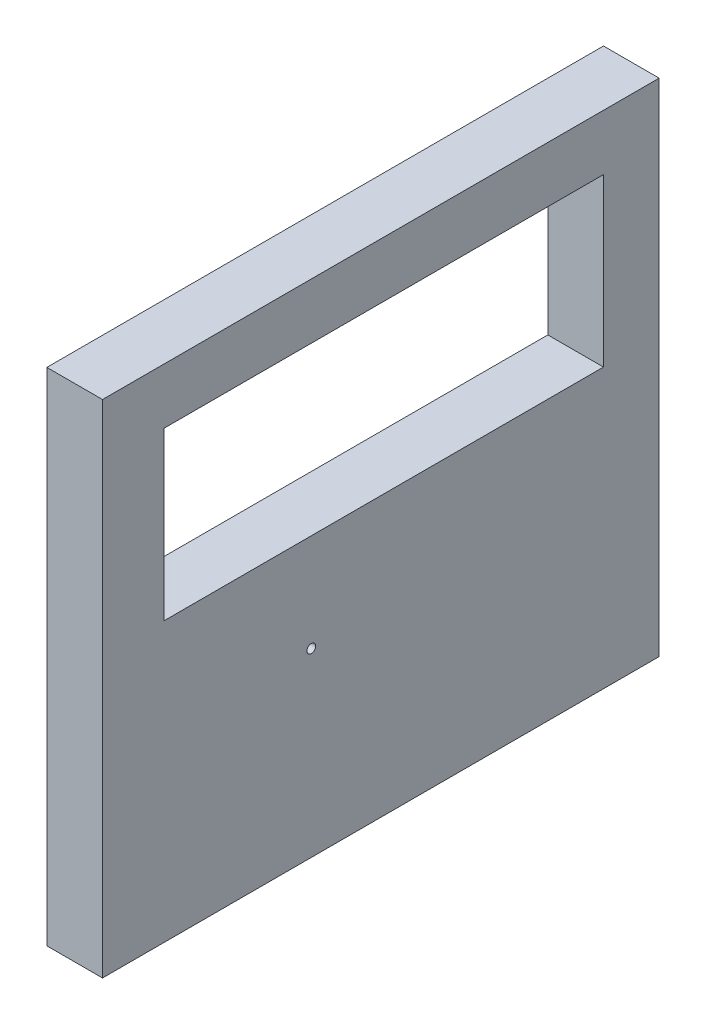
ISO-10303-21;
HEADER;
FILE_DESCRIPTION(('STEP AP214'),'2;1');
FILE_NAME('part.step','',(''),(''),'','','');
FILE_SCHEMA(('AUTOMOTIVE_DESIGN { 1 0 10303 214 1 1 1 1 }'));
ENDSEC;
DATA;
#1=APPLICATION_CONTEXT('core data for automotive mechanical design processes');
#2=APPLICATION_PROTOCOL_DEFINITION('international standard','automotive_design',2000,#1);
#3=PRODUCT_CONTEXT('',#1,'mechanical');
#4=PRODUCT('Part','Part','',(#3));
#5=PRODUCT_RELATED_PRODUCT_CATEGORY('part','',(#4));
#6=PRODUCT_DEFINITION_FORMATION('','',#4);
#7=PRODUCT_DEFINITION_CONTEXT('part definition',#1,'design');
#8=PRODUCT_DEFINITION('design','',#6,#7);
#9=PRODUCT_DEFINITION_SHAPE('','',#8);
#10=(LENGTH_UNIT() NAMED_UNIT(*) SI_UNIT(.MILLI.,.METRE.));
#11=(NAMED_UNIT(*) PLANE_ANGLE_UNIT() SI_UNIT($,.RADIAN.));
#12=(NAMED_UNIT(*) SI_UNIT($,.STERADIAN.) SOLID_ANGLE_UNIT());
#13=UNCERTAINTY_MEASURE_WITH_UNIT(LENGTH_MEASURE(1.E-05),#10,'distance_accuracy_value','');
#14=(GEOMETRIC_REPRESENTATION_CONTEXT(3) GLOBAL_UNCERTAINTY_ASSIGNED_CONTEXT((#13)) GLOBAL_UNIT_ASSIGNED_CONTEXT((#10,
#11,#12)) REPRESENTATION_CONTEXT('',''));
#15=CARTESIAN_POINT('',(0.,0.,0.));
#16=DIRECTION('',(0.,0.,1.));
#17=DIRECTION('',(1.,0.,0.));
#18=AXIS2_PLACEMENT_3D('',#15,#16,#17);
#19=CARTESIAN_POINT('',(12.7,-114.3,254.));
#20=DIRECTION('',(-1.,0.,0.));
#21=DIRECTION('',(0.,0.,1.));
#22=AXIS2_PLACEMENT_3D('',#19,#20,#21);
#23=PLANE('',#22);
#24=CARTESIAN_POINT('',(12.7,-31.75,158.75));
#25=DIRECTION('',(1.,0.,0.));
#26=DIRECTION('',(0.,0.,-1.));
#27=AXIS2_PLACEMENT_3D('',#24,#25,#26);
#28=CIRCLE('',#27,2.);
#29=CARTESIAN_POINT('',(12.7,-31.75,156.75));
#30=VERTEX_POINT('',#29);
#31=EDGE_CURVE('E127',#30,#30,#28,.T.);
#32=ORIENTED_EDGE('',*,*,#31,.F.);
#33=EDGE_LOOP('',(#32));
#34=FACE_BOUND('',#33,.T.);
#35=DIRECTION('',(0.,1.,0.));
#36=VECTOR('',#35,1.);
#37=CARTESIAN_POINT('',(12.7,-114.3,0.));
#38=LINE('',#37,#36);
#39=CARTESIAN_POINT('',(12.7,-114.3,0.));
#40=VERTEX_POINT('',#39);
#41=CARTESIAN_POINT('',(12.7,114.3,0.));
#42=VERTEX_POINT('',#41);
#43=EDGE_CURVE('E140',#40,#42,#38,.T.);
#44=ORIENTED_EDGE('',*,*,#43,.T.);
#45=DIRECTION('',(0.,0.,-1.));
#46=VECTOR('',#45,1.);
#47=CARTESIAN_POINT('',(12.7,114.3,254.));
#48=LINE('',#47,#46);
#49=CARTESIAN_POINT('',(12.7,114.3,254.));
#50=VERTEX_POINT('',#49);
#51=EDGE_CURVE('E11',#50,#42,#48,.T.);
#52=ORIENTED_EDGE('',*,*,#51,.F.);
#53=DIRECTION('',(0.,1.,0.));
#54=VECTOR('',#53,1.);
#55=CARTESIAN_POINT('',(12.7,-114.3,254.));
#56=LINE('',#55,#54);
#57=CARTESIAN_POINT('',(12.7,-114.3,254.));
#58=VERTEX_POINT('',#57);
#59=EDGE_CURVE('E144',#58,#50,#56,.T.);
#60=ORIENTED_EDGE('',*,*,#59,.F.);
#61=DIRECTION('',(0.,0.,-1.));
#62=VECTOR('',#61,1.);
#63=CARTESIAN_POINT('',(12.7,-114.3,254.));
#64=LINE('',#63,#62);
#65=EDGE_CURVE('E154',#58,#40,#64,.T.);
#66=ORIENTED_EDGE('',*,*,#65,.T.);
#67=EDGE_LOOP('',(#44,#52,#60,#66));
#68=FACE_BOUND('',#67,.T.);
#69=DIRECTION('',(0.,0.,-1.));
#70=VECTOR('',#69,1.);
#71=CARTESIAN_POINT('',(12.7,88.9000000000001,0.));
#72=LINE('',#71,#70);
#73=CARTESIAN_POINT('',(12.7,88.9,226.000000100001));
#74=VERTEX_POINT('',#73);
#75=CARTESIAN_POINT('',(12.7,88.9000000000001,25.4000001000014));
#76=VERTEX_POINT('',#75);
#77=EDGE_CURVE('E55',#74,#76,#72,.T.);
#78=ORIENTED_EDGE('',*,*,#77,.T.);
#79=DIRECTION('',(0.,-1.,-1.31450241935415E-09));
#80=VECTOR('',#79,1.);
#81=CARTESIAN_POINT('',(12.7,-3.33883614294356E-08,25.3999999831421));
#82=LINE('',#81,#80);
#83=CARTESIAN_POINT('',(12.7,12.8250000000002,25.4000000000006));
#84=VERTEX_POINT('',#83);
#85=EDGE_CURVE('E121',#76,#84,#82,.T.);
#86=ORIENTED_EDGE('',*,*,#85,.T.);
#87=DIRECTION('',(0.,0.,1.));
#88=VECTOR('',#87,1.);
#89=CARTESIAN_POINT('',(12.7,12.8250000000002,0.));
#90=LINE('',#89,#88);
#91=CARTESIAN_POINT('',(12.7,12.825,226.000000100001));
#92=VERTEX_POINT('',#91);
#93=EDGE_CURVE('E124',#84,#92,#90,.T.);
#94=ORIENTED_EDGE('',*,*,#93,.T.);
#95=DIRECTION('',(0.,-1.,0.));
#96=VECTOR('',#95,1.);
#97=CARTESIAN_POINT('',(12.7,0.,226.000000100001));
#98=LINE('',#97,#96);
#99=EDGE_CURVE('E133',#74,#92,#98,.T.);
#100=ORIENTED_EDGE('',*,*,#99,.F.);
#101=EDGE_LOOP('',(#78,#86,#94,#100));
#102=FACE_BOUND('',#101,.T.);
#103=ADVANCED_FACE('F41',(#34,#68,#102),#23,.F.);
#104=CARTESIAN_POINT('',(-12.7,-114.3,254.));
#105=DIRECTION('',(1.,0.,0.));
#106=DIRECTION('',(0.,0.,-1.));
#107=AXIS2_PLACEMENT_3D('',#104,#105,#106);
#108=PLANE('',#107);
#109=CARTESIAN_POINT('',(-12.7,-31.75,158.75));
#110=DIRECTION('',(1.,0.,0.));
#111=DIRECTION('',(0.,0.,-1.));
#112=AXIS2_PLACEMENT_3D('',#109,#110,#111);
#113=CIRCLE('',#112,2.);
#114=CARTESIAN_POINT('',(-12.7,-31.75,156.75));
#115=VERTEX_POINT('',#114);
#116=EDGE_CURVE('E134',#115,#115,#113,.T.);
#117=ORIENTED_EDGE('',*,*,#116,.T.);
#118=EDGE_LOOP('',(#117));
#119=FACE_BOUND('',#118,.T.);
#120=DIRECTION('',(0.,-1.,0.));
#121=VECTOR('',#120,1.);
#122=CARTESIAN_POINT('',(-12.7,-114.3,0.));
#123=LINE('',#122,#121);
#124=CARTESIAN_POINT('',(-12.7,114.3,0.));
#125=VERTEX_POINT('',#124);
#126=CARTESIAN_POINT('',(-12.7,-114.3,0.));
#127=VERTEX_POINT('',#126);
#128=EDGE_CURVE('E159',#125,#127,#123,.T.);
#129=ORIENTED_EDGE('',*,*,#128,.T.);
#130=DIRECTION('',(0.,0.,-1.));
#131=VECTOR('',#130,1.);
#132=CARTESIAN_POINT('',(-12.7,-114.3,254.));
#133=LINE('',#132,#131);
#134=CARTESIAN_POINT('',(-12.7,-114.3,254.));
#135=VERTEX_POINT('',#134);
#136=EDGE_CURVE('E164',#135,#127,#133,.T.);
#137=ORIENTED_EDGE('',*,*,#136,.F.);
#138=DIRECTION('',(0.,-1.,0.));
#139=VECTOR('',#138,1.);
#140=CARTESIAN_POINT('',(-12.7,-114.3,254.));
#141=LINE('',#140,#139);
#142=CARTESIAN_POINT('',(-12.7,114.3,254.));
#143=VERTEX_POINT('',#142);
#144=EDGE_CURVE('E150',#143,#135,#141,.T.);
#145=ORIENTED_EDGE('',*,*,#144,.F.);
#146=DIRECTION('',(0.,0.,-1.));
#147=VECTOR('',#146,1.);
#148=CARTESIAN_POINT('',(-12.7,114.3,254.));
#149=LINE('',#148,#147);
#150=EDGE_CURVE('E48',#143,#125,#149,.T.);
#151=ORIENTED_EDGE('',*,*,#150,.T.);
#152=EDGE_LOOP('',(#129,#137,#145,#151));
#153=FACE_BOUND('',#152,.T.);
#154=DIRECTION('',(0.,0.,-1.));
#155=VECTOR('',#154,1.);
#156=CARTESIAN_POINT('',(-12.7,88.9000000000001,0.));
#157=LINE('',#156,#155);
#158=CARTESIAN_POINT('',(-12.7,88.9,226.000000100001));
#159=VERTEX_POINT('',#158);
#160=CARTESIAN_POINT('',(-12.7,88.9000000000001,25.4000001000014));
#161=VERTEX_POINT('',#160);
#162=EDGE_CURVE('E107',#159,#161,#157,.T.);
#163=ORIENTED_EDGE('',*,*,#162,.F.);
#164=DIRECTION('',(0.,-1.,0.));
#165=VECTOR('',#164,1.);
#166=CARTESIAN_POINT('',(-12.7,0.,226.000000100001));
#167=LINE('',#166,#165);
#168=CARTESIAN_POINT('',(-12.7,12.825,226.000000100001));
#169=VERTEX_POINT('',#168);
#170=EDGE_CURVE('E113',#159,#169,#167,.T.);
#171=ORIENTED_EDGE('',*,*,#170,.T.);
#172=DIRECTION('',(0.,0.,1.));
#173=VECTOR('',#172,1.);
#174=CARTESIAN_POINT('',(-12.7,12.8250000000002,0.));
#175=LINE('',#174,#173);
#176=CARTESIAN_POINT('',(-12.7,12.8250000000002,25.4000000000006));
#177=VERTEX_POINT('',#176);
#178=EDGE_CURVE('E117',#177,#169,#175,.T.);
#179=ORIENTED_EDGE('',*,*,#178,.F.);
#180=DIRECTION('',(0.,-1.,-1.31450241935415E-09));
#181=VECTOR('',#180,1.);
#182=CARTESIAN_POINT('',(-12.7,-3.33883614294356E-08,25.3999999831421));
#183=LINE('',#182,#181);
#184=EDGE_CURVE('E110',#161,#177,#183,.T.);
#185=ORIENTED_EDGE('',*,*,#184,.F.);
#186=EDGE_LOOP('',(#163,#171,#179,#185));
#187=FACE_BOUND('',#186,.T.);
#188=ADVANCED_FACE('F120',(#119,#153,#187),#108,.F.);
#189=CARTESIAN_POINT('',(-12.7,114.3,254.));
#190=DIRECTION('',(0.,-1.,0.));
#191=DIRECTION('',(0.,0.,-1.));
#192=AXIS2_PLACEMENT_3D('',#189,#190,#191);
#193=PLANE('',#192);
#194=DIRECTION('',(-1.,0.,0.));
#195=VECTOR('',#194,1.);
#196=CARTESIAN_POINT('',(-12.7,114.3,0.));
#197=LINE('',#196,#195);
#198=EDGE_CURVE('E157',#42,#125,#197,.T.);
#199=ORIENTED_EDGE('',*,*,#198,.T.);
#200=ORIENTED_EDGE('',*,*,#150,.F.);
#201=DIRECTION('',(-1.,0.,0.));
#202=VECTOR('',#201,1.);
#203=CARTESIAN_POINT('',(-12.7,114.3,254.));
#204=LINE('',#203,#202);
#205=EDGE_CURVE('E147',#50,#143,#204,.T.);
#206=ORIENTED_EDGE('',*,*,#205,.F.);
#207=ORIENTED_EDGE('',*,*,#51,.T.);
#208=EDGE_LOOP('',(#199,#200,#206,#207));
#209=FACE_BOUND('',#208,.T.);
#210=ADVANCED_FACE('F187',(#209),#193,.F.);
#211=CARTESIAN_POINT('',(-12.7,-114.3,254.));
#212=DIRECTION('',(0.,1.,0.));
#213=DIRECTION('',(0.,0.,1.));
#214=AXIS2_PLACEMENT_3D('',#211,#212,#213);
#215=PLANE('',#214);
#216=DIRECTION('',(1.,0.,0.));
#217=VECTOR('',#216,1.);
#218=CARTESIAN_POINT('',(-12.7,-114.3,0.));
#219=LINE('',#218,#217);
#220=EDGE_CURVE('E148',#127,#40,#219,.T.);
#221=ORIENTED_EDGE('',*,*,#220,.T.);
#222=ORIENTED_EDGE('',*,*,#65,.F.);
#223=DIRECTION('',(1.,0.,0.));
#224=VECTOR('',#223,1.);
#225=CARTESIAN_POINT('',(-12.7,-114.3,254.));
#226=LINE('',#225,#224);
#227=EDGE_CURVE('E152',#135,#58,#226,.T.);
#228=ORIENTED_EDGE('',*,*,#227,.F.);
#229=ORIENTED_EDGE('',*,*,#136,.T.);
#230=EDGE_LOOP('',(#221,#222,#228,#229));
#231=FACE_BOUND('',#230,.T.);
#232=ADVANCED_FACE('F179',(#231),#215,.F.);
#233=CARTESIAN_POINT('',(0.,0.,254.));
#234=DIRECTION('',(0.,0.,-1.));
#235=DIRECTION('',(-1.,0.,0.));
#236=AXIS2_PLACEMENT_3D('',#233,#234,#235);
#237=PLANE('',#236);
#238=ORIENTED_EDGE('',*,*,#59,.T.);
#239=ORIENTED_EDGE('',*,*,#205,.T.);
#240=ORIENTED_EDGE('',*,*,#144,.T.);
#241=ORIENTED_EDGE('',*,*,#227,.T.);
#242=EDGE_LOOP('',(#238,#239,#240,#241));
#243=FACE_BOUND('',#242,.T.);
#244=ADVANCED_FACE('F186',(#243),#237,.F.);
#245=CARTESIAN_POINT('',(0.,0.,0.));
#246=DIRECTION('',(0.,0.,-1.));
#247=DIRECTION('',(-1.,0.,0.));
#248=AXIS2_PLACEMENT_3D('',#245,#246,#247);
#249=PLANE('',#248);
#250=ORIENTED_EDGE('',*,*,#43,.F.);
#251=ORIENTED_EDGE('',*,*,#220,.F.);
#252=ORIENTED_EDGE('',*,*,#128,.F.);
#253=ORIENTED_EDGE('',*,*,#198,.F.);
#254=EDGE_LOOP('',(#250,#251,#252,#253));
#255=FACE_BOUND('',#254,.T.);
#256=ADVANCED_FACE('F176',(#255),#249,.T.);
#257=CARTESIAN_POINT('',(-12.7,88.9000000000001,0.));
#258=DIRECTION('',(0.,-1.,0.));
#259=DIRECTION('',(0.,0.,-1.));
#260=AXIS2_PLACEMENT_3D('',#257,#258,#259);
#261=PLANE('',#260);
#262=ORIENTED_EDGE('',*,*,#77,.F.);
#263=DIRECTION('',(1.,0.,0.));
#264=VECTOR('',#263,1.);
#265=CARTESIAN_POINT('',(-12.7,88.9,226.000000100001));
#266=LINE('',#265,#264);
#267=EDGE_CURVE('E104',#159,#74,#266,.T.);
#268=ORIENTED_EDGE('',*,*,#267,.F.);
#269=ORIENTED_EDGE('',*,*,#162,.T.);
#270=DIRECTION('',(1.,0.,0.));
#271=VECTOR('',#270,1.);
#272=CARTESIAN_POINT('',(-12.7,88.9000000000001,25.4000001000014));
#273=LINE('',#272,#271);
#274=EDGE_CURVE('E138',#161,#76,#273,.T.);
#275=ORIENTED_EDGE('',*,*,#274,.T.);
#276=EDGE_LOOP('',(#262,#268,#269,#275));
#277=FACE_BOUND('',#276,.T.);
#278=ADVANCED_FACE('F105',(#277),#261,.T.);
#279=CARTESIAN_POINT('',(-12.7,-3.33883614294356E-08,25.3999999831421));
#280=DIRECTION('',(0.,-1.31450241935415E-09,1.));
#281=DIRECTION('',(0.,-1.,-1.31450241935415E-09));
#282=AXIS2_PLACEMENT_3D('',#279,#280,#281);
#283=PLANE('',#282);
#284=ORIENTED_EDGE('',*,*,#85,.F.);
#285=ORIENTED_EDGE('',*,*,#274,.F.);
#286=ORIENTED_EDGE('',*,*,#184,.T.);
#287=DIRECTION('',(1.,0.,0.));
#288=VECTOR('',#287,1.);
#289=CARTESIAN_POINT('',(-12.7,12.8250000000002,25.4000000000006));
#290=LINE('',#289,#288);
#291=EDGE_CURVE('E141',#177,#84,#290,.T.);
#292=ORIENTED_EDGE('',*,*,#291,.T.);
#293=EDGE_LOOP('',(#284,#285,#286,#292));
#294=FACE_BOUND('',#293,.T.);
#295=ADVANCED_FACE('F215',(#294),#283,.T.);
#296=CARTESIAN_POINT('',(-12.7,12.8250000000002,0.));
#297=DIRECTION('',(0.,1.,0.));
#298=DIRECTION('',(0.,0.,1.));
#299=AXIS2_PLACEMENT_3D('',#296,#297,#298);
#300=PLANE('',#299);
#301=ORIENTED_EDGE('',*,*,#93,.F.);
#302=ORIENTED_EDGE('',*,*,#291,.F.);
#303=ORIENTED_EDGE('',*,*,#178,.T.);
#304=DIRECTION('',(1.,0.,0.));
#305=VECTOR('',#304,1.);
#306=CARTESIAN_POINT('',(-12.7,12.825,226.000000100001));
#307=LINE('',#306,#305);
#308=EDGE_CURVE('E63',#169,#92,#307,.T.);
#309=ORIENTED_EDGE('',*,*,#308,.T.);
#310=EDGE_LOOP('',(#301,#302,#303,#309));
#311=FACE_BOUND('',#310,.T.);
#312=ADVANCED_FACE('F212',(#311),#300,.T.);
#313=CARTESIAN_POINT('',(-12.7,0.,226.000000100001));
#314=DIRECTION('',(0.,0.,1.));
#315=DIRECTION('',(1.,0.,0.));
#316=AXIS2_PLACEMENT_3D('',#313,#314,#315);
#317=PLANE('',#316);
#318=ORIENTED_EDGE('',*,*,#99,.T.);
#319=ORIENTED_EDGE('',*,*,#308,.F.);
#320=ORIENTED_EDGE('',*,*,#170,.F.);
#321=ORIENTED_EDGE('',*,*,#267,.T.);
#322=EDGE_LOOP('',(#318,#319,#320,#321));
#323=FACE_BOUND('',#322,.T.);
#324=ADVANCED_FACE('F114',(#323),#317,.F.);
#325=CARTESIAN_POINT('',(-12.7,-31.75,158.75));
#326=DIRECTION('',(1.,0.,0.));
#327=DIRECTION('',(0.,0.,-1.));
#328=AXIS2_PLACEMENT_3D('',#325,#326,#327);
#329=CYLINDRICAL_SURFACE('',#328,2.);
#330=ORIENTED_EDGE('',*,*,#116,.F.);
#331=EDGE_LOOP('',(#330));
#332=FACE_BOUND('',#331,.T.);
#333=ORIENTED_EDGE('',*,*,#31,.T.);
#334=EDGE_LOOP('',(#333));
#335=FACE_BOUND('',#334,.T.);
#336=ADVANCED_FACE('F207',(#332,#335),#329,.F.);
#337=CLOSED_SHELL('',(#103,#188,#210,#232,#244,#256,#278,#295,#312,#324,#336));
#338=MANIFOLD_SOLID_BREP('B2',#337);
#339=ADVANCED_BREP_SHAPE_REPRESENTATION('',(#18,#338),#14);
#340=SHAPE_DEFINITION_REPRESENTATION(#9,#339);
ENDSEC;
END-ISO-10303-21;
